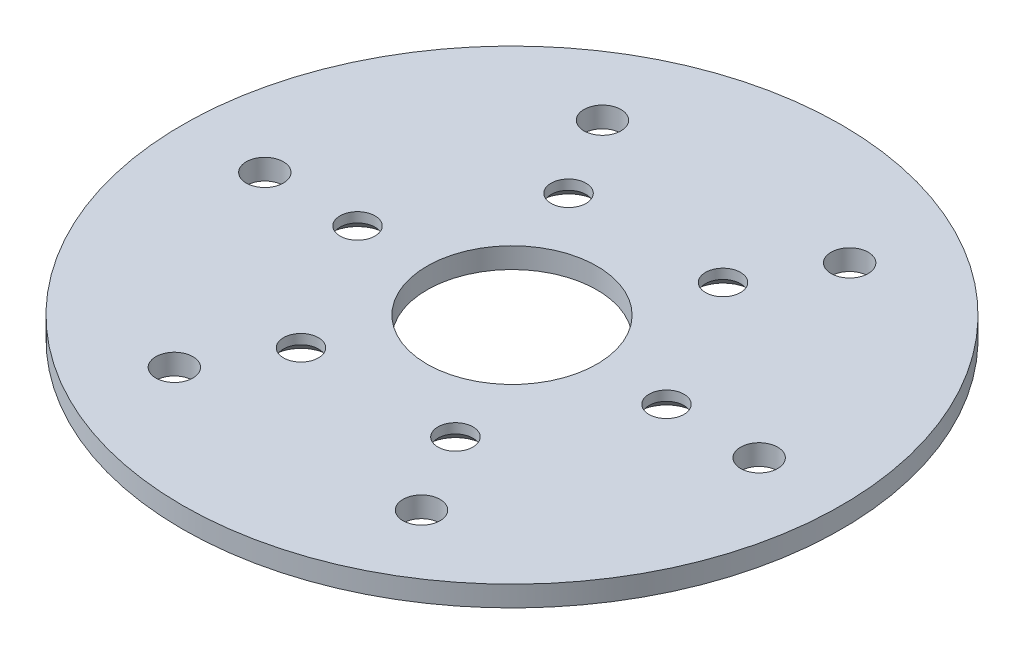
ISO-10303-21;
HEADER;
FILE_DESCRIPTION(('STEP AP214'),'2;1');
FILE_NAME('part.step','',(''),(''),'','','');
FILE_SCHEMA(('AUTOMOTIVE_DESIGN { 1 0 10303 214 1 1 1 1 }'));
ENDSEC;
DATA;
#1=APPLICATION_CONTEXT('core data for automotive mechanical design processes');
#2=APPLICATION_PROTOCOL_DEFINITION('international standard','automotive_design',2000,#1);
#3=PRODUCT_CONTEXT('',#1,'mechanical');
#4=PRODUCT('Part','Part','',(#3));
#5=PRODUCT_RELATED_PRODUCT_CATEGORY('part','',(#4));
#6=PRODUCT_DEFINITION_FORMATION('','',#4);
#7=PRODUCT_DEFINITION_CONTEXT('part definition',#1,'design');
#8=PRODUCT_DEFINITION('design','',#6,#7);
#9=PRODUCT_DEFINITION_SHAPE('','',#8);
#10=(LENGTH_UNIT() NAMED_UNIT(*) SI_UNIT(.MILLI.,.METRE.));
#11=(NAMED_UNIT(*) PLANE_ANGLE_UNIT() SI_UNIT($,.RADIAN.));
#12=(NAMED_UNIT(*) SI_UNIT($,.STERADIAN.) SOLID_ANGLE_UNIT());
#13=UNCERTAINTY_MEASURE_WITH_UNIT(LENGTH_MEASURE(1.E-05),#10,'distance_accuracy_value','');
#14=(GEOMETRIC_REPRESENTATION_CONTEXT(3) GLOBAL_UNCERTAINTY_ASSIGNED_CONTEXT((#13)) GLOBAL_UNIT_ASSIGNED_CONTEXT((#10,
#11,#12)) REPRESENTATION_CONTEXT('',''));
#15=CARTESIAN_POINT('',(0.,0.,0.));
#16=DIRECTION('',(0.,0.,1.));
#17=DIRECTION('',(1.,0.,0.));
#18=AXIS2_PLACEMENT_3D('',#15,#16,#17);
#19=CARTESIAN_POINT('',(0.,0.,0.));
#20=DIRECTION('',(0.,1.,0.));
#21=DIRECTION('',(0.,0.,1.));
#22=AXIS2_PLACEMENT_3D('',#19,#20,#21);
#23=PLANE('',#22);
#24=CARTESIAN_POINT('',(-7.49999999999815,0.,12.9903810567677));
#25=DIRECTION('',(0.,-1.,0.));
#26=DIRECTION('',(0.,0.,-1.));
#27=AXIS2_PLACEMENT_3D('',#24,#25,#26);
#28=CIRCLE('',#27,2.75);
#29=CARTESIAN_POINT('',(-7.49999999999815,0.,10.2403810567677));
#30=VERTEX_POINT('',#29);
#31=EDGE_CURVE('E73',#30,#30,#28,.T.);
#32=ORIENTED_EDGE('',*,*,#31,.F.);
#33=EDGE_LOOP('',(#32));
#34=FACE_BOUND('',#33,.T.);
#35=CARTESIAN_POINT('',(-14.9999999999991,0.,1.6393623848986E-12));
#36=DIRECTION('',(0.,-1.,0.));
#37=DIRECTION('',(0.,0.,-1.));
#38=AXIS2_PLACEMENT_3D('',#35,#36,#37);
#39=CIRCLE('',#38,2.75);
#40=CARTESIAN_POINT('',(-14.9999999999991,0.,-2.74999999999836));
#41=VERTEX_POINT('',#40);
#42=EDGE_CURVE('E64',#41,#41,#39,.T.);
#43=ORIENTED_EDGE('',*,*,#42,.F.);
#44=EDGE_LOOP('',(#43));
#45=FACE_BOUND('',#44,.T.);
#46=CARTESIAN_POINT('',(-7.50000000000005,0.,-12.9903810567655));
#47=DIRECTION('',(0.,-1.,0.));
#48=DIRECTION('',(0.,0.,-1.));
#49=AXIS2_PLACEMENT_3D('',#46,#47,#48);
#50=CIRCLE('',#49,2.75);
#51=CARTESIAN_POINT('',(-7.50000000000005,0.,-15.7403810567655));
#52=VERTEX_POINT('',#51);
#53=EDGE_CURVE('E55',#52,#52,#50,.T.);
#54=ORIENTED_EDGE('',*,*,#53,.F.);
#55=EDGE_LOOP('',(#54));
#56=FACE_BOUND('',#55,.T.);
#57=CARTESIAN_POINT('',(0.,0.,0.));
#58=DIRECTION('',(0.,1.,0.));
#59=DIRECTION('',(0.,0.,1.));
#60=AXIS2_PLACEMENT_3D('',#57,#58,#59);
#61=CIRCLE('',#60,32.);
#62=CARTESIAN_POINT('',(0.,0.,32.));
#63=VERTEX_POINT('',#62);
#64=EDGE_CURVE('E35',#63,#63,#61,.T.);
#65=ORIENTED_EDGE('',*,*,#64,.F.);
#66=EDGE_LOOP('',(#65));
#67=FACE_BOUND('',#66,.T.);
#68=CARTESIAN_POINT('',(0.,0.,0.));
#69=DIRECTION('',(0.,1.,0.));
#70=DIRECTION('',(0.,0.,1.));
#71=AXIS2_PLACEMENT_3D('',#68,#69,#70);
#72=CIRCLE('',#71,8.25);
#73=CARTESIAN_POINT('',(0.,0.,8.25));
#74=VERTEX_POINT('',#73);
#75=EDGE_CURVE('E44',#74,#74,#72,.T.);
#76=ORIENTED_EDGE('',*,*,#75,.T.);
#77=EDGE_LOOP('',(#76));
#78=FACE_BOUND('',#77,.T.);
#79=CARTESIAN_POINT('',(7.50000000000186,0.,12.9903810567666));
#80=DIRECTION('',(0.,-1.,0.));
#81=DIRECTION('',(0.,0.,-1.));
#82=AXIS2_PLACEMENT_3D('',#79,#80,#81);
#83=CIRCLE('',#82,2.75);
#84=CARTESIAN_POINT('',(7.50000000000186,0.,10.2403810567666));
#85=VERTEX_POINT('',#84);
#86=EDGE_CURVE('E82',#85,#85,#83,.T.);
#87=ORIENTED_EDGE('',*,*,#86,.F.);
#88=EDGE_LOOP('',(#87));
#89=FACE_BOUND('',#88,.T.);
#90=CARTESIAN_POINT('',(15.0000000000009,0.,-5.59930701972027E-13));
#91=DIRECTION('',(0.,-1.,0.));
#92=DIRECTION('',(0.,0.,-1.));
#93=AXIS2_PLACEMENT_3D('',#90,#91,#92);
#94=CIRCLE('',#93,2.75);
#95=CARTESIAN_POINT('',(15.0000000000009,0.,-2.75000000000056));
#96=VERTEX_POINT('',#95);
#97=EDGE_CURVE('E91',#96,#96,#94,.T.);
#98=ORIENTED_EDGE('',*,*,#97,.F.);
#99=EDGE_LOOP('',(#98));
#100=FACE_BOUND('',#99,.T.);
#101=CARTESIAN_POINT('',(7.49999999999997,0.,-12.9903810567666));
#102=DIRECTION('',(0.,-1.,0.));
#103=DIRECTION('',(0.,0.,-1.));
#104=AXIS2_PLACEMENT_3D('',#101,#102,#103);
#105=CIRCLE('',#104,2.75);
#106=CARTESIAN_POINT('',(7.49999999999997,0.,-15.7403810567666));
#107=VERTEX_POINT('',#106);
#108=EDGE_CURVE('E100',#107,#107,#105,.T.);
#109=ORIENTED_EDGE('',*,*,#108,.F.);
#110=EDGE_LOOP('',(#109));
#111=FACE_BOUND('',#110,.T.);
#112=CARTESIAN_POINT('',(12.0000000000002,0.,20.7846096908264));
#113=DIRECTION('',(0.,-1.,0.));
#114=DIRECTION('',(0.,0.,-1.));
#115=AXIS2_PLACEMENT_3D('',#112,#113,#114);
#116=CIRCLE('',#115,1.8);
#117=CARTESIAN_POINT('',(12.0000000000002,0.,18.9846096908264));
#118=VERTEX_POINT('',#117);
#119=EDGE_CURVE('E106',#118,#118,#116,.T.);
#120=ORIENTED_EDGE('',*,*,#119,.F.);
#121=EDGE_LOOP('',(#120));
#122=FACE_BOUND('',#121,.T.);
#123=CARTESIAN_POINT('',(-11.9999999999998,0.,20.7846096908266));
#124=DIRECTION('',(0.,-1.,0.));
#125=DIRECTION('',(0.,0.,-1.));
#126=AXIS2_PLACEMENT_3D('',#123,#124,#125);
#127=CIRCLE('',#126,1.8);
#128=CARTESIAN_POINT('',(-11.9999999999998,0.,18.9846096908266));
#129=VERTEX_POINT('',#128);
#130=EDGE_CURVE('E112',#129,#129,#127,.T.);
#131=ORIENTED_EDGE('',*,*,#130,.F.);
#132=EDGE_LOOP('',(#131));
#133=FACE_BOUND('',#132,.T.);
#134=CARTESIAN_POINT('',(-24.,0.,1.6759110426447E-13));
#135=DIRECTION('',(0.,-1.,0.));
#136=DIRECTION('',(0.,0.,-1.));
#137=AXIS2_PLACEMENT_3D('',#134,#135,#136);
#138=CIRCLE('',#137,1.8);
#139=CARTESIAN_POINT('',(-24.,0.,-1.79999999999983));
#140=VERTEX_POINT('',#139);
#141=EDGE_CURVE('E118',#140,#140,#138,.T.);
#142=ORIENTED_EDGE('',*,*,#141,.F.);
#143=EDGE_LOOP('',(#142));
#144=FACE_BOUND('',#143,.T.);
#145=CARTESIAN_POINT('',(-12.0000000000001,0.,-20.7846096908265));
#146=DIRECTION('',(0.,-1.,0.));
#147=DIRECTION('',(0.,0.,-1.));
#148=AXIS2_PLACEMENT_3D('',#145,#146,#147);
#149=CIRCLE('',#148,1.8);
#150=CARTESIAN_POINT('',(-12.0000000000001,0.,-22.5846096908265));
#151=VERTEX_POINT('',#150);
#152=EDGE_CURVE('E124',#151,#151,#149,.T.);
#153=ORIENTED_EDGE('',*,*,#152,.F.);
#154=EDGE_LOOP('',(#153));
#155=FACE_BOUND('',#154,.T.);
#156=CARTESIAN_POINT('',(12.,0.,-20.7846096908266));
#157=DIRECTION('',(0.,-1.,0.));
#158=DIRECTION('',(0.,0.,-1.));
#159=AXIS2_PLACEMENT_3D('',#156,#157,#158);
#160=CIRCLE('',#159,1.8);
#161=CARTESIAN_POINT('',(12.,0.,-22.5846096908266));
#162=VERTEX_POINT('',#161);
#163=EDGE_CURVE('E130',#162,#162,#160,.T.);
#164=ORIENTED_EDGE('',*,*,#163,.F.);
#165=EDGE_LOOP('',(#164));
#166=FACE_BOUND('',#165,.T.);
#167=CARTESIAN_POINT('',(24.,0.,0.));
#168=DIRECTION('',(0.,-1.,0.));
#169=DIRECTION('',(0.,0.,-1.));
#170=AXIS2_PLACEMENT_3D('',#167,#168,#169);
#171=CIRCLE('',#170,1.8);
#172=CARTESIAN_POINT('',(24.,0.,-1.8));
#173=VERTEX_POINT('',#172);
#174=EDGE_CURVE('E136',#173,#173,#171,.T.);
#175=ORIENTED_EDGE('',*,*,#174,.F.);
#176=EDGE_LOOP('',(#175));
#177=FACE_BOUND('',#176,.T.);
#178=ADVANCED_FACE('F31',(#34,#45,#56,#67,#78,#89,#100,#111,#122,#133,#144,#155,#166,#177),#23,.F.);
#179=CARTESIAN_POINT('',(0.,2.,0.));
#180=DIRECTION('',(0.,1.,0.));
#181=DIRECTION('',(0.,0.,1.));
#182=AXIS2_PLACEMENT_3D('',#179,#180,#181);
#183=PLANE('',#182);
#184=CARTESIAN_POINT('',(24.,2.,0.));
#185=DIRECTION('',(0.,1.,0.));
#186=DIRECTION('',(0.,0.,1.));
#187=AXIS2_PLACEMENT_3D('',#184,#185,#186);
#188=CIRCLE('',#187,1.8);
#189=CARTESIAN_POINT('',(24.,2.,1.8));
#190=VERTEX_POINT('',#189);
#191=EDGE_CURVE('E133',#190,#190,#188,.T.);
#192=ORIENTED_EDGE('',*,*,#191,.F.);
#193=EDGE_LOOP('',(#192));
#194=FACE_BOUND('',#193,.T.);
#195=CARTESIAN_POINT('',(12.,2.,-20.7846096908266));
#196=DIRECTION('',(0.,1.,0.));
#197=DIRECTION('',(0.,0.,1.));
#198=AXIS2_PLACEMENT_3D('',#195,#196,#197);
#199=CIRCLE('',#198,1.8);
#200=CARTESIAN_POINT('',(12.,2.,-18.9846096908266));
#201=VERTEX_POINT('',#200);
#202=EDGE_CURVE('E127',#201,#201,#199,.T.);
#203=ORIENTED_EDGE('',*,*,#202,.F.);
#204=EDGE_LOOP('',(#203));
#205=FACE_BOUND('',#204,.T.);
#206=CARTESIAN_POINT('',(-12.0000000000001,2.,-20.7846096908265));
#207=DIRECTION('',(0.,1.,0.));
#208=DIRECTION('',(0.,0.,1.));
#209=AXIS2_PLACEMENT_3D('',#206,#207,#208);
#210=CIRCLE('',#209,1.8);
#211=CARTESIAN_POINT('',(-12.0000000000001,2.,-18.9846096908265));
#212=VERTEX_POINT('',#211);
#213=EDGE_CURVE('E121',#212,#212,#210,.T.);
#214=ORIENTED_EDGE('',*,*,#213,.F.);
#215=EDGE_LOOP('',(#214));
#216=FACE_BOUND('',#215,.T.);
#217=CARTESIAN_POINT('',(-24.,2.,1.6759110426447E-13));
#218=DIRECTION('',(0.,1.,0.));
#219=DIRECTION('',(0.,0.,1.));
#220=AXIS2_PLACEMENT_3D('',#217,#218,#219);
#221=CIRCLE('',#220,1.8);
#222=CARTESIAN_POINT('',(-24.,2.,1.80000000000017));
#223=VERTEX_POINT('',#222);
#224=EDGE_CURVE('E115',#223,#223,#221,.T.);
#225=ORIENTED_EDGE('',*,*,#224,.F.);
#226=EDGE_LOOP('',(#225));
#227=FACE_BOUND('',#226,.T.);
#228=CARTESIAN_POINT('',(-11.9999999999998,2.,20.7846096908266));
#229=DIRECTION('',(0.,1.,0.));
#230=DIRECTION('',(0.,0.,1.));
#231=AXIS2_PLACEMENT_3D('',#228,#229,#230);
#232=CIRCLE('',#231,1.8);
#233=CARTESIAN_POINT('',(-11.9999999999998,2.,22.5846096908266));
#234=VERTEX_POINT('',#233);
#235=EDGE_CURVE('E109',#234,#234,#232,.T.);
#236=ORIENTED_EDGE('',*,*,#235,.F.);
#237=EDGE_LOOP('',(#236));
#238=FACE_BOUND('',#237,.T.);
#239=CARTESIAN_POINT('',(12.0000000000002,2.,20.7846096908264));
#240=DIRECTION('',(0.,1.,0.));
#241=DIRECTION('',(0.,0.,1.));
#242=AXIS2_PLACEMENT_3D('',#239,#240,#241);
#243=CIRCLE('',#242,1.8);
#244=CARTESIAN_POINT('',(12.0000000000002,2.,22.5846096908264));
#245=VERTEX_POINT('',#244);
#246=EDGE_CURVE('E103',#245,#245,#243,.T.);
#247=ORIENTED_EDGE('',*,*,#246,.F.);
#248=EDGE_LOOP('',(#247));
#249=FACE_BOUND('',#248,.T.);
#250=CARTESIAN_POINT('',(7.49999999999997,2.,-12.9903810567666));
#251=DIRECTION('',(0.,1.,0.));
#252=DIRECTION('',(0.,0.,1.));
#253=AXIS2_PLACEMENT_3D('',#250,#251,#252);
#254=CIRCLE('',#253,1.7);
#255=CARTESIAN_POINT('',(7.49999999999997,2.,-11.2903810567666));
#256=VERTEX_POINT('',#255);
#257=EDGE_CURVE('E94',#256,#256,#254,.T.);
#258=ORIENTED_EDGE('',*,*,#257,.F.);
#259=EDGE_LOOP('',(#258));
#260=FACE_BOUND('',#259,.T.);
#261=CARTESIAN_POINT('',(15.0000000000009,2.,-5.59930701972027E-13));
#262=DIRECTION('',(0.,1.,0.));
#263=DIRECTION('',(0.,0.,1.));
#264=AXIS2_PLACEMENT_3D('',#261,#262,#263);
#265=CIRCLE('',#264,1.7);
#266=CARTESIAN_POINT('',(15.0000000000009,2.,1.69999999999944));
#267=VERTEX_POINT('',#266);
#268=EDGE_CURVE('E85',#267,#267,#265,.T.);
#269=ORIENTED_EDGE('',*,*,#268,.F.);
#270=EDGE_LOOP('',(#269));
#271=FACE_BOUND('',#270,.T.);
#272=CARTESIAN_POINT('',(7.50000000000186,2.,12.9903810567666));
#273=DIRECTION('',(0.,1.,0.));
#274=DIRECTION('',(0.,0.,1.));
#275=AXIS2_PLACEMENT_3D('',#272,#273,#274);
#276=CIRCLE('',#275,1.7);
#277=CARTESIAN_POINT('',(7.50000000000186,2.,14.6903810567666));
#278=VERTEX_POINT('',#277);
#279=EDGE_CURVE('E76',#278,#278,#276,.T.);
#280=ORIENTED_EDGE('',*,*,#279,.F.);
#281=EDGE_LOOP('',(#280));
#282=FACE_BOUND('',#281,.T.);
#283=CARTESIAN_POINT('',(-7.49999999999815,2.,12.9903810567677));
#284=DIRECTION('',(0.,1.,0.));
#285=DIRECTION('',(0.,0.,1.));
#286=AXIS2_PLACEMENT_3D('',#283,#284,#285);
#287=CIRCLE('',#286,1.7);
#288=CARTESIAN_POINT('',(-7.49999999999815,2.,14.6903810567677));
#289=VERTEX_POINT('',#288);
#290=EDGE_CURVE('E67',#289,#289,#287,.T.);
#291=ORIENTED_EDGE('',*,*,#290,.F.);
#292=EDGE_LOOP('',(#291));
#293=FACE_BOUND('',#292,.T.);
#294=CARTESIAN_POINT('',(-14.9999999999991,2.,1.6393623848986E-12));
#295=DIRECTION('',(0.,1.,0.));
#296=DIRECTION('',(0.,0.,1.));
#297=AXIS2_PLACEMENT_3D('',#294,#295,#296);
#298=CIRCLE('',#297,1.7);
#299=CARTESIAN_POINT('',(-14.9999999999991,2.,1.70000000000164));
#300=VERTEX_POINT('',#299);
#301=EDGE_CURVE('E58',#300,#300,#298,.T.);
#302=ORIENTED_EDGE('',*,*,#301,.F.);
#303=EDGE_LOOP('',(#302));
#304=FACE_BOUND('',#303,.T.);
#305=CARTESIAN_POINT('',(-7.50000000000005,2.,-12.9903810567655));
#306=DIRECTION('',(0.,1.,0.));
#307=DIRECTION('',(0.,0.,1.));
#308=AXIS2_PLACEMENT_3D('',#305,#306,#307);
#309=CIRCLE('',#308,1.7);
#310=CARTESIAN_POINT('',(-7.50000000000005,2.,-11.2903810567655));
#311=VERTEX_POINT('',#310);
#312=EDGE_CURVE('E47',#311,#311,#309,.T.);
#313=ORIENTED_EDGE('',*,*,#312,.F.);
#314=EDGE_LOOP('',(#313));
#315=FACE_BOUND('',#314,.T.);
#316=CARTESIAN_POINT('',(0.,2.,0.));
#317=DIRECTION('',(0.,1.,0.));
#318=DIRECTION('',(0.,0.,1.));
#319=AXIS2_PLACEMENT_3D('',#316,#317,#318);
#320=CIRCLE('',#319,32.);
#321=CARTESIAN_POINT('',(0.,2.,32.));
#322=VERTEX_POINT('',#321);
#323=EDGE_CURVE('E10',#322,#322,#320,.T.);
#324=ORIENTED_EDGE('',*,*,#323,.T.);
#325=EDGE_LOOP('',(#324));
#326=FACE_BOUND('',#325,.T.);
#327=CARTESIAN_POINT('',(0.,2.,0.));
#328=DIRECTION('',(0.,1.,0.));
#329=DIRECTION('',(0.,0.,1.));
#330=AXIS2_PLACEMENT_3D('',#327,#328,#329);
#331=CIRCLE('',#330,8.25);
#332=CARTESIAN_POINT('',(0.,2.,8.25));
#333=VERTEX_POINT('',#332);
#334=EDGE_CURVE('E42',#333,#333,#331,.T.);
#335=ORIENTED_EDGE('',*,*,#334,.F.);
#336=EDGE_LOOP('',(#335));
#337=FACE_BOUND('',#336,.T.);
#338=ADVANCED_FACE('F144',(#194,#205,#216,#227,#238,#249,#260,#271,#282,#293,#304,#315,#326,
#337),#183,.T.);
#339=CARTESIAN_POINT('',(0.,2.,0.));
#340=DIRECTION('',(0.,-1.,0.));
#341=DIRECTION('',(0.,0.,-1.));
#342=AXIS2_PLACEMENT_3D('',#339,#340,#341);
#343=CYLINDRICAL_SURFACE('',#342,32.);
#344=ORIENTED_EDGE('',*,*,#323,.F.);
#345=EDGE_LOOP('',(#344));
#346=FACE_BOUND('',#345,.T.);
#347=ORIENTED_EDGE('',*,*,#64,.T.);
#348=EDGE_LOOP('',(#347));
#349=FACE_BOUND('',#348,.T.);
#350=ADVANCED_FACE('F33',(#346,#349),#343,.T.);
#351=CARTESIAN_POINT('',(0.,2.,0.));
#352=DIRECTION('',(0.,-1.,0.));
#353=DIRECTION('',(0.,0.,-1.));
#354=AXIS2_PLACEMENT_3D('',#351,#352,#353);
#355=CYLINDRICAL_SURFACE('',#354,8.25);
#356=ORIENTED_EDGE('',*,*,#334,.T.);
#357=EDGE_LOOP('',(#356));
#358=FACE_BOUND('',#357,.T.);
#359=ORIENTED_EDGE('',*,*,#75,.F.);
#360=EDGE_LOOP('',(#359));
#361=FACE_BOUND('',#360,.T.);
#362=ADVANCED_FACE('F154',(#358,#361),#355,.F.);
#363=CARTESIAN_POINT('',(-7.50000000000005,0.,-12.9903810567655));
#364=DIRECTION('',(0.,-1.,0.));
#365=DIRECTION('',(0.,0.,-1.));
#366=AXIS2_PLACEMENT_3D('',#363,#364,#365);
#367=CYLINDRICAL_SURFACE('',#366,1.7);
#368=CARTESIAN_POINT('',(-7.50000000000005,1.05,-12.9903810567655));
#369=DIRECTION('',(0.,-1.,0.));
#370=DIRECTION('',(0.,0.,-1.));
#371=AXIS2_PLACEMENT_3D('',#368,#369,#370);
#372=CIRCLE('',#371,1.7);
#373=CARTESIAN_POINT('',(-7.50000000000005,1.05,-14.6903810567655));
#374=VERTEX_POINT('',#373);
#375=EDGE_CURVE('E52',#374,#374,#372,.T.);
#376=ORIENTED_EDGE('',*,*,#375,.T.);
#377=EDGE_LOOP('',(#376));
#378=FACE_BOUND('',#377,.T.);
#379=ORIENTED_EDGE('',*,*,#312,.T.);
#380=EDGE_LOOP('',(#379));
#381=FACE_BOUND('',#380,.T.);
#382=ADVANCED_FACE('F157',(#378,#381),#367,.F.);
#383=CARTESIAN_POINT('',(-7.50000000000005,0.,-12.9903810567655));
#384=DIRECTION('',(0.,-1.,0.));
#385=DIRECTION('',(0.,0.,-1.));
#386=AXIS2_PLACEMENT_3D('',#383,#384,#385);
#387=CONICAL_SURFACE('',#386,2.75,0.785398163397448);
#388=ORIENTED_EDGE('',*,*,#375,.F.);
#389=EDGE_LOOP('',(#388));
#390=FACE_BOUND('',#389,.T.);
#391=ORIENTED_EDGE('',*,*,#53,.T.);
#392=EDGE_LOOP('',(#391));
#393=FACE_BOUND('',#392,.T.);
#394=ADVANCED_FACE('F161',(#390,#393),#387,.F.);
#395=CARTESIAN_POINT('',(-14.9999999999991,0.,1.6393623848986E-12));
#396=DIRECTION('',(0.,-1.,0.));
#397=DIRECTION('',(0.,0.,-1.));
#398=AXIS2_PLACEMENT_3D('',#395,#396,#397);
#399=CYLINDRICAL_SURFACE('',#398,1.7);
#400=CARTESIAN_POINT('',(-14.9999999999991,1.05,1.6393623848986E-12));
#401=DIRECTION('',(0.,-1.,0.));
#402=DIRECTION('',(0.,0.,-1.));
#403=AXIS2_PLACEMENT_3D('',#400,#401,#402);
#404=CIRCLE('',#403,1.7);
#405=CARTESIAN_POINT('',(-14.9999999999991,1.05,-1.69999999999836));
#406=VERTEX_POINT('',#405);
#407=EDGE_CURVE('E61',#406,#406,#404,.T.);
#408=ORIENTED_EDGE('',*,*,#407,.T.);
#409=EDGE_LOOP('',(#408));
#410=FACE_BOUND('',#409,.T.);
#411=ORIENTED_EDGE('',*,*,#301,.T.);
#412=EDGE_LOOP('',(#411));
#413=FACE_BOUND('',#412,.T.);
#414=ADVANCED_FACE('F165',(#410,#413),#399,.F.);
#415=CARTESIAN_POINT('',(-14.9999999999991,0.,1.6393623848986E-12));
#416=DIRECTION('',(0.,-1.,0.));
#417=DIRECTION('',(0.,0.,-1.));
#418=AXIS2_PLACEMENT_3D('',#415,#416,#417);
#419=CONICAL_SURFACE('',#418,2.75,0.785398163397447);
#420=ORIENTED_EDGE('',*,*,#407,.F.);
#421=EDGE_LOOP('',(#420));
#422=FACE_BOUND('',#421,.T.);
#423=ORIENTED_EDGE('',*,*,#42,.T.);
#424=EDGE_LOOP('',(#423));
#425=FACE_BOUND('',#424,.T.);
#426=ADVANCED_FACE('F169',(#422,#425),#419,.F.);
#427=CARTESIAN_POINT('',(-7.49999999999815,0.,12.9903810567677));
#428=DIRECTION('',(0.,-1.,0.));
#429=DIRECTION('',(0.,0.,-1.));
#430=AXIS2_PLACEMENT_3D('',#427,#428,#429);
#431=CYLINDRICAL_SURFACE('',#430,1.7);
#432=CARTESIAN_POINT('',(-7.49999999999815,1.05,12.9903810567677));
#433=DIRECTION('',(0.,-1.,0.));
#434=DIRECTION('',(0.,0.,-1.));
#435=AXIS2_PLACEMENT_3D('',#432,#433,#434);
#436=CIRCLE('',#435,1.7);
#437=CARTESIAN_POINT('',(-7.49999999999815,1.05,11.2903810567677));
#438=VERTEX_POINT('',#437);
#439=EDGE_CURVE('E70',#438,#438,#436,.T.);
#440=ORIENTED_EDGE('',*,*,#439,.T.);
#441=EDGE_LOOP('',(#440));
#442=FACE_BOUND('',#441,.T.);
#443=ORIENTED_EDGE('',*,*,#290,.T.);
#444=EDGE_LOOP('',(#443));
#445=FACE_BOUND('',#444,.T.);
#446=ADVANCED_FACE('F173',(#442,#445),#431,.F.);
#447=CARTESIAN_POINT('',(-7.49999999999815,0.,12.9903810567677));
#448=DIRECTION('',(0.,-1.,0.));
#449=DIRECTION('',(0.,0.,-1.));
#450=AXIS2_PLACEMENT_3D('',#447,#448,#449);
#451=CONICAL_SURFACE('',#450,2.75,0.785398163397448);
#452=ORIENTED_EDGE('',*,*,#439,.F.);
#453=EDGE_LOOP('',(#452));
#454=FACE_BOUND('',#453,.T.);
#455=ORIENTED_EDGE('',*,*,#31,.T.);
#456=EDGE_LOOP('',(#455));
#457=FACE_BOUND('',#456,.T.);
#458=ADVANCED_FACE('F177',(#454,#457),#451,.F.);
#459=CARTESIAN_POINT('',(7.50000000000186,0.,12.9903810567666));
#460=DIRECTION('',(0.,-1.,0.));
#461=DIRECTION('',(0.,0.,-1.));
#462=AXIS2_PLACEMENT_3D('',#459,#460,#461);
#463=CYLINDRICAL_SURFACE('',#462,1.7);
#464=CARTESIAN_POINT('',(7.50000000000186,1.05,12.9903810567666));
#465=DIRECTION('',(0.,-1.,0.));
#466=DIRECTION('',(0.,0.,-1.));
#467=AXIS2_PLACEMENT_3D('',#464,#465,#466);
#468=CIRCLE('',#467,1.7);
#469=CARTESIAN_POINT('',(7.50000000000186,1.05,11.2903810567666));
#470=VERTEX_POINT('',#469);
#471=EDGE_CURVE('E79',#470,#470,#468,.T.);
#472=ORIENTED_EDGE('',*,*,#471,.T.);
#473=EDGE_LOOP('',(#472));
#474=FACE_BOUND('',#473,.T.);
#475=ORIENTED_EDGE('',*,*,#279,.T.);
#476=EDGE_LOOP('',(#475));
#477=FACE_BOUND('',#476,.T.);
#478=ADVANCED_FACE('F181',(#474,#477),#463,.F.);
#479=CARTESIAN_POINT('',(7.50000000000186,0.,12.9903810567666));
#480=DIRECTION('',(0.,-1.,0.));
#481=DIRECTION('',(0.,0.,-1.));
#482=AXIS2_PLACEMENT_3D('',#479,#480,#481);
#483=CONICAL_SURFACE('',#482,2.75,0.785398163397447);
#484=ORIENTED_EDGE('',*,*,#471,.F.);
#485=EDGE_LOOP('',(#484));
#486=FACE_BOUND('',#485,.T.);
#487=ORIENTED_EDGE('',*,*,#86,.T.);
#488=EDGE_LOOP('',(#487));
#489=FACE_BOUND('',#488,.T.);
#490=ADVANCED_FACE('F185',(#486,#489),#483,.F.);
#491=CARTESIAN_POINT('',(15.0000000000009,0.,-5.59930701972027E-13));
#492=DIRECTION('',(0.,-1.,0.));
#493=DIRECTION('',(0.,0.,-1.));
#494=AXIS2_PLACEMENT_3D('',#491,#492,#493);
#495=CYLINDRICAL_SURFACE('',#494,1.7);
#496=CARTESIAN_POINT('',(15.0000000000009,1.05,-5.59930701972027E-13));
#497=DIRECTION('',(0.,-1.,0.));
#498=DIRECTION('',(0.,0.,-1.));
#499=AXIS2_PLACEMENT_3D('',#496,#497,#498);
#500=CIRCLE('',#499,1.7);
#501=CARTESIAN_POINT('',(15.0000000000009,1.05,-1.70000000000056));
#502=VERTEX_POINT('',#501);
#503=EDGE_CURVE('E88',#502,#502,#500,.T.);
#504=ORIENTED_EDGE('',*,*,#503,.T.);
#505=EDGE_LOOP('',(#504));
#506=FACE_BOUND('',#505,.T.);
#507=ORIENTED_EDGE('',*,*,#268,.T.);
#508=EDGE_LOOP('',(#507));
#509=FACE_BOUND('',#508,.T.);
#510=ADVANCED_FACE('F189',(#506,#509),#495,.F.);
#511=CARTESIAN_POINT('',(15.0000000000009,0.,-5.59930701972027E-13));
#512=DIRECTION('',(0.,-1.,0.));
#513=DIRECTION('',(0.,0.,-1.));
#514=AXIS2_PLACEMENT_3D('',#511,#512,#513);
#515=CONICAL_SURFACE('',#514,2.75,0.785398163397447);
#516=ORIENTED_EDGE('',*,*,#503,.F.);
#517=EDGE_LOOP('',(#516));
#518=FACE_BOUND('',#517,.T.);
#519=ORIENTED_EDGE('',*,*,#97,.T.);
#520=EDGE_LOOP('',(#519));
#521=FACE_BOUND('',#520,.T.);
#522=ADVANCED_FACE('F193',(#518,#521),#515,.F.);
#523=CARTESIAN_POINT('',(7.49999999999997,0.,-12.9903810567666));
#524=DIRECTION('',(0.,-1.,0.));
#525=DIRECTION('',(0.,0.,-1.));
#526=AXIS2_PLACEMENT_3D('',#523,#524,#525);
#527=CYLINDRICAL_SURFACE('',#526,1.7);
#528=CARTESIAN_POINT('',(7.49999999999997,1.05,-12.9903810567666));
#529=DIRECTION('',(0.,-1.,0.));
#530=DIRECTION('',(0.,0.,-1.));
#531=AXIS2_PLACEMENT_3D('',#528,#529,#530);
#532=CIRCLE('',#531,1.7);
#533=CARTESIAN_POINT('',(7.49999999999997,1.05,-14.6903810567666));
#534=VERTEX_POINT('',#533);
#535=EDGE_CURVE('E97',#534,#534,#532,.T.);
#536=ORIENTED_EDGE('',*,*,#535,.T.);
#537=EDGE_LOOP('',(#536));
#538=FACE_BOUND('',#537,.T.);
#539=ORIENTED_EDGE('',*,*,#257,.T.);
#540=EDGE_LOOP('',(#539));
#541=FACE_BOUND('',#540,.T.);
#542=ADVANCED_FACE('F197',(#538,#541),#527,.F.);
#543=CARTESIAN_POINT('',(7.49999999999997,0.,-12.9903810567666));
#544=DIRECTION('',(0.,-1.,0.));
#545=DIRECTION('',(0.,0.,-1.));
#546=AXIS2_PLACEMENT_3D('',#543,#544,#545);
#547=CONICAL_SURFACE('',#546,2.75,0.785398163397448);
#548=ORIENTED_EDGE('',*,*,#535,.F.);
#549=EDGE_LOOP('',(#548));
#550=FACE_BOUND('',#549,.T.);
#551=ORIENTED_EDGE('',*,*,#108,.T.);
#552=EDGE_LOOP('',(#551));
#553=FACE_BOUND('',#552,.T.);
#554=ADVANCED_FACE('F201',(#550,#553),#547,.F.);
#555=CARTESIAN_POINT('',(12.0000000000002,0.,20.7846096908264));
#556=DIRECTION('',(0.,-1.,0.));
#557=DIRECTION('',(0.,0.,-1.));
#558=AXIS2_PLACEMENT_3D('',#555,#556,#557);
#559=CYLINDRICAL_SURFACE('',#558,1.8);
#560=ORIENTED_EDGE('',*,*,#119,.T.);
#561=EDGE_LOOP('',(#560));
#562=FACE_BOUND('',#561,.T.);
#563=ORIENTED_EDGE('',*,*,#246,.T.);
#564=EDGE_LOOP('',(#563));
#565=FACE_BOUND('',#564,.T.);
#566=ADVANCED_FACE('F205',(#562,#565),#559,.F.);
#567=CARTESIAN_POINT('',(-11.9999999999998,0.,20.7846096908266));
#568=DIRECTION('',(0.,-1.,0.));
#569=DIRECTION('',(0.,0.,-1.));
#570=AXIS2_PLACEMENT_3D('',#567,#568,#569);
#571=CYLINDRICAL_SURFACE('',#570,1.8);
#572=ORIENTED_EDGE('',*,*,#130,.T.);
#573=EDGE_LOOP('',(#572));
#574=FACE_BOUND('',#573,.T.);
#575=ORIENTED_EDGE('',*,*,#235,.T.);
#576=EDGE_LOOP('',(#575));
#577=FACE_BOUND('',#576,.T.);
#578=ADVANCED_FACE('F209',(#574,#577),#571,.F.);
#579=CARTESIAN_POINT('',(-24.,0.,1.6759110426447E-13));
#580=DIRECTION('',(0.,-1.,0.));
#581=DIRECTION('',(0.,0.,-1.));
#582=AXIS2_PLACEMENT_3D('',#579,#580,#581);
#583=CYLINDRICAL_SURFACE('',#582,1.8);
#584=ORIENTED_EDGE('',*,*,#141,.T.);
#585=EDGE_LOOP('',(#584));
#586=FACE_BOUND('',#585,.T.);
#587=ORIENTED_EDGE('',*,*,#224,.T.);
#588=EDGE_LOOP('',(#587));
#589=FACE_BOUND('',#588,.T.);
#590=ADVANCED_FACE('F213',(#586,#589),#583,.F.);
#591=CARTESIAN_POINT('',(-12.0000000000001,0.,-20.7846096908265));
#592=DIRECTION('',(0.,-1.,0.));
#593=DIRECTION('',(0.,0.,-1.));
#594=AXIS2_PLACEMENT_3D('',#591,#592,#593);
#595=CYLINDRICAL_SURFACE('',#594,1.8);
#596=ORIENTED_EDGE('',*,*,#152,.T.);
#597=EDGE_LOOP('',(#596));
#598=FACE_BOUND('',#597,.T.);
#599=ORIENTED_EDGE('',*,*,#213,.T.);
#600=EDGE_LOOP('',(#599));
#601=FACE_BOUND('',#600,.T.);
#602=ADVANCED_FACE('F217',(#598,#601),#595,.F.);
#603=CARTESIAN_POINT('',(12.,0.,-20.7846096908266));
#604=DIRECTION('',(0.,-1.,0.));
#605=DIRECTION('',(0.,0.,-1.));
#606=AXIS2_PLACEMENT_3D('',#603,#604,#605);
#607=CYLINDRICAL_SURFACE('',#606,1.8);
#608=ORIENTED_EDGE('',*,*,#163,.T.);
#609=EDGE_LOOP('',(#608));
#610=FACE_BOUND('',#609,.T.);
#611=ORIENTED_EDGE('',*,*,#202,.T.);
#612=EDGE_LOOP('',(#611));
#613=FACE_BOUND('',#612,.T.);
#614=ADVANCED_FACE('F221',(#610,#613),#607,.F.);
#615=CARTESIAN_POINT('',(24.,0.,0.));
#616=DIRECTION('',(0.,-1.,0.));
#617=DIRECTION('',(0.,0.,-1.));
#618=AXIS2_PLACEMENT_3D('',#615,#616,#617);
#619=CYLINDRICAL_SURFACE('',#618,1.8);
#620=ORIENTED_EDGE('',*,*,#174,.T.);
#621=EDGE_LOOP('',(#620));
#622=FACE_BOUND('',#621,.T.);
#623=ORIENTED_EDGE('',*,*,#191,.T.);
#624=EDGE_LOOP('',(#623));
#625=FACE_BOUND('',#624,.T.);
#626=ADVANCED_FACE('F140',(#622,#625),#619,.F.);
#627=CLOSED_SHELL('',(#178,#338,#350,#362,#382,#394,#414,#426,#446,#458,#478,#490,#510,#522,
#542,#554,#566,#578,#590,#602,#614,#626));
#628=MANIFOLD_SOLID_BREP('B2',#627);
#629=ADVANCED_BREP_SHAPE_REPRESENTATION('',(#18,#628),#14);
#630=SHAPE_DEFINITION_REPRESENTATION(#9,#629);
ENDSEC;
END-ISO-10303-21;
